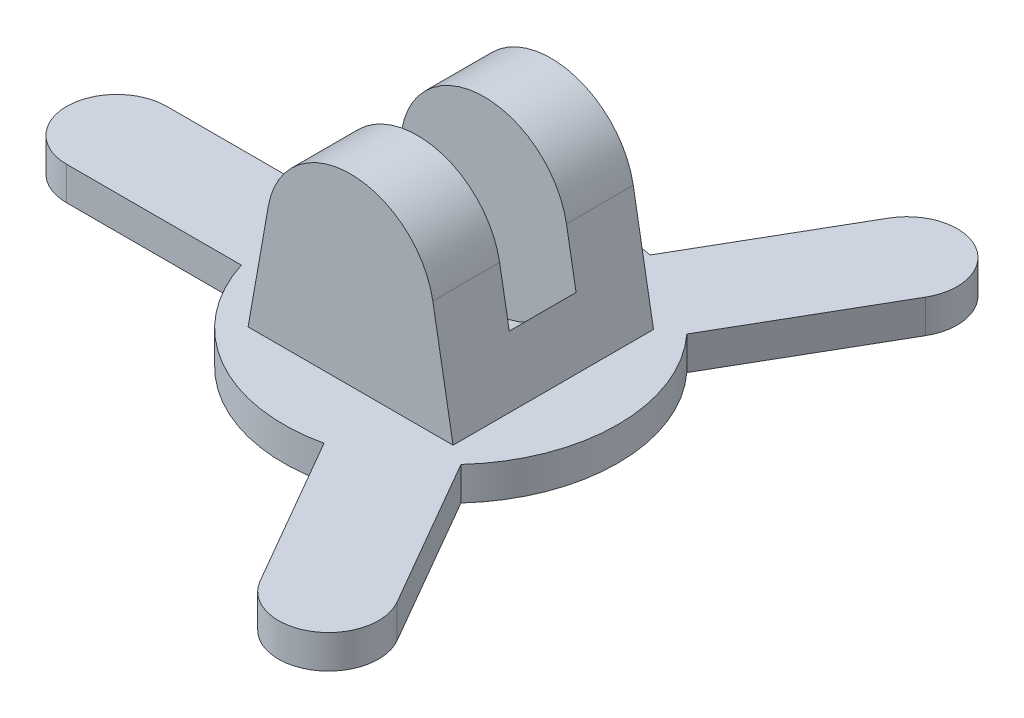
ISO-10303-21;
HEADER;
FILE_DESCRIPTION(('STEP AP214'),'2;1');
FILE_NAME('part.step','',(''),(''),'','','');
FILE_SCHEMA(('AUTOMOTIVE_DESIGN { 1 0 10303 214 1 1 1 1 }'));
ENDSEC;
DATA;
#1=APPLICATION_CONTEXT('core data for automotive mechanical design processes');
#2=APPLICATION_PROTOCOL_DEFINITION('international standard','automotive_design',2000,#1);
#3=PRODUCT_CONTEXT('',#1,'mechanical');
#4=PRODUCT('Part','Part','',(#3));
#5=PRODUCT_RELATED_PRODUCT_CATEGORY('part','',(#4));
#6=PRODUCT_DEFINITION_FORMATION('','',#4);
#7=PRODUCT_DEFINITION_CONTEXT('part definition',#1,'design');
#8=PRODUCT_DEFINITION('design','',#6,#7);
#9=PRODUCT_DEFINITION_SHAPE('','',#8);
#10=(LENGTH_UNIT() NAMED_UNIT(*) SI_UNIT(.MILLI.,.METRE.));
#11=(NAMED_UNIT(*) PLANE_ANGLE_UNIT() SI_UNIT($,.RADIAN.));
#12=(NAMED_UNIT(*) SI_UNIT($,.STERADIAN.) SOLID_ANGLE_UNIT());
#13=UNCERTAINTY_MEASURE_WITH_UNIT(LENGTH_MEASURE(1.E-05),#10,'distance_accuracy_value','');
#14=(GEOMETRIC_REPRESENTATION_CONTEXT(3) GLOBAL_UNCERTAINTY_ASSIGNED_CONTEXT((#13)) GLOBAL_UNIT_ASSIGNED_CONTEXT((#10,
#11,#12)) REPRESENTATION_CONTEXT('',''));
#15=CARTESIAN_POINT('',(0.,0.,0.));
#16=DIRECTION('',(0.,0.,1.));
#17=DIRECTION('',(1.,0.,0.));
#18=AXIS2_PLACEMENT_3D('',#15,#16,#17);
#19=CARTESIAN_POINT('',(12.3100969126526,2.17060222083668,15.));
#20=DIRECTION('',(-0.984807753012207,-0.173648177666934,0.));
#21=DIRECTION('',(0.173648177666934,-0.984807753012207,0.));
#22=AXIS2_PLACEMENT_3D('',#19,#20,#21);
#23=PLANE('',#22);
#24=DIRECTION('',(-0.173648177666934,0.984807753012207,0.));
#25=VECTOR('',#24,1.);
#26=CARTESIAN_POINT('',(12.3100969126526,2.17060222083668,-5.));
#27=LINE('',#26,#25);
#28=CARTESIAN_POINT('',(13.7499115397781,-5.99499229759953,-5.));
#29=VERTEX_POINT('',#28);
#30=CARTESIAN_POINT('',(12.3100969126526,2.17060222083668,-5.));
#31=VERTEX_POINT('',#30);
#32=EDGE_CURVE('E211',#29,#31,#27,.T.);
#33=ORIENTED_EDGE('',*,*,#32,.F.);
#34=DIRECTION('',(0.,0.,-1.));
#35=VECTOR('',#34,1.);
#36=CARTESIAN_POINT('',(13.7499115397781,-5.99499229759953,47.4264068711929));
#37=LINE('',#36,#35);
#38=CARTESIAN_POINT('',(13.7499115397781,-5.99499229759953,5.));
#39=VERTEX_POINT('',#38);
#40=EDGE_CURVE('E213',#39,#29,#37,.T.);
#41=ORIENTED_EDGE('',*,*,#40,.F.);
#42=DIRECTION('',(-0.173648177666934,0.984807753012207,0.));
#43=VECTOR('',#42,1.);
#44=CARTESIAN_POINT('',(12.3100969126526,2.17060222083668,5.));
#45=LINE('',#44,#43);
#46=CARTESIAN_POINT('',(12.3100969126526,2.17060222083668,5.));
#47=VERTEX_POINT('',#46);
#48=EDGE_CURVE('E199',#39,#47,#45,.T.);
#49=ORIENTED_EDGE('',*,*,#48,.T.);
#50=DIRECTION('',(0.,0.,-1.));
#51=VECTOR('',#50,1.);
#52=CARTESIAN_POINT('',(12.3100969126526,2.17060222083668,15.));
#53=LINE('',#52,#51);
#54=CARTESIAN_POINT('',(12.3100969126526,2.17060222083668,15.));
#55=VERTEX_POINT('',#54);
#56=EDGE_CURVE('E48',#55,#47,#53,.T.);
#57=ORIENTED_EDGE('',*,*,#56,.F.);
#58=DIRECTION('',(-0.173648177666934,0.984807753012207,0.));
#59=VECTOR('',#58,1.);
#60=CARTESIAN_POINT('',(12.3100969126526,2.17060222083668,15.));
#61=LINE('',#60,#59);
#62=CARTESIAN_POINT('',(15.3377373591989,-15.,15.));
#63=VERTEX_POINT('',#62);
#64=EDGE_CURVE('E310',#63,#55,#61,.T.);
#65=ORIENTED_EDGE('',*,*,#64,.F.);
#66=DIRECTION('',(0.,0.,-1.));
#67=VECTOR('',#66,1.);
#68=CARTESIAN_POINT('',(15.3377373591989,-15.,15.));
#69=LINE('',#68,#67);
#70=CARTESIAN_POINT('',(15.3377373591989,-15.,-15.));
#71=VERTEX_POINT('',#70);
#72=EDGE_CURVE('E78',#63,#71,#69,.T.);
#73=ORIENTED_EDGE('',*,*,#72,.T.);
#74=DIRECTION('',(-0.173648177666934,0.984807753012207,0.));
#75=VECTOR('',#74,1.);
#76=CARTESIAN_POINT('',(12.3100969126526,2.17060222083668,-15.));
#77=LINE('',#76,#75);
#78=CARTESIAN_POINT('',(12.3100969126526,2.17060222083668,-15.));
#79=VERTEX_POINT('',#78);
#80=EDGE_CURVE('E308',#71,#79,#77,.T.);
#81=ORIENTED_EDGE('',*,*,#80,.T.);
#82=EDGE_CURVE('E328',#31,#79,#53,.T.);
#83=ORIENTED_EDGE('',*,*,#82,.F.);
#84=EDGE_LOOP('',(#33,#41,#49,#57,#65,#73,#81,#83));
#85=FACE_BOUND('',#84,.T.);
#86=ADVANCED_FACE('F40',(#85),#23,.F.);
#87=CARTESIAN_POINT('',(-12.3100969126526,2.17060222083668,15.));
#88=DIRECTION('',(0.984807753012207,-0.173648177666934,0.));
#89=DIRECTION('',(0.173648177666934,0.984807753012207,0.));
#90=AXIS2_PLACEMENT_3D('',#87,#88,#89);
#91=PLANE('',#90);
#92=DIRECTION('',(-0.173648177666934,-0.984807753012207,0.));
#93=VECTOR('',#92,1.);
#94=CARTESIAN_POINT('',(-12.3100969126526,2.17060222083668,-5.));
#95=LINE('',#94,#93);
#96=CARTESIAN_POINT('',(-12.3100969126526,2.17060222083668,-5.));
#97=VERTEX_POINT('',#96);
#98=CARTESIAN_POINT('',(-13.7499115397781,-5.99499229759954,-5.));
#99=VERTEX_POINT('',#98);
#100=EDGE_CURVE('E206',#97,#99,#95,.T.);
#101=ORIENTED_EDGE('',*,*,#100,.F.);
#102=DIRECTION('',(0.,0.,-1.));
#103=VECTOR('',#102,1.);
#104=CARTESIAN_POINT('',(-12.3100969126526,2.17060222083668,15.));
#105=LINE('',#104,#103);
#106=CARTESIAN_POINT('',(-12.3100969126526,2.17060222083668,-15.));
#107=VERTEX_POINT('',#106);
#108=EDGE_CURVE('E71',#97,#107,#105,.T.);
#109=ORIENTED_EDGE('',*,*,#108,.T.);
#110=DIRECTION('',(-0.173648177666934,-0.984807753012207,0.));
#111=VECTOR('',#110,1.);
#112=CARTESIAN_POINT('',(-12.3100969126526,2.17060222083668,-15.));
#113=LINE('',#112,#111);
#114=CARTESIAN_POINT('',(-15.3377373591989,-15.,-15.));
#115=VERTEX_POINT('',#114);
#116=EDGE_CURVE('E320',#107,#115,#113,.T.);
#117=ORIENTED_EDGE('',*,*,#116,.T.);
#118=DIRECTION('',(0.,0.,-1.));
#119=VECTOR('',#118,1.);
#120=CARTESIAN_POINT('',(-15.3377373591989,-15.,15.));
#121=LINE('',#120,#119);
#122=CARTESIAN_POINT('',(-15.3377373591989,-15.,15.));
#123=VERTEX_POINT('',#122);
#124=EDGE_CURVE('E325',#123,#115,#121,.T.);
#125=ORIENTED_EDGE('',*,*,#124,.F.);
#126=DIRECTION('',(-0.173648177666934,-0.984807753012207,0.));
#127=VECTOR('',#126,1.);
#128=CARTESIAN_POINT('',(-12.3100969126526,2.17060222083668,15.));
#129=LINE('',#128,#127);
#130=CARTESIAN_POINT('',(-12.3100969126526,2.17060222083668,15.));
#131=VERTEX_POINT('',#130);
#132=EDGE_CURVE('E314',#131,#123,#129,.T.);
#133=ORIENTED_EDGE('',*,*,#132,.F.);
#134=CARTESIAN_POINT('',(-12.3100969126526,2.17060222083668,5.));
#135=VERTEX_POINT('',#134);
#136=EDGE_CURVE('E204',#131,#135,#105,.T.);
#137=ORIENTED_EDGE('',*,*,#136,.T.);
#138=DIRECTION('',(-0.173648177666934,-0.984807753012207,0.));
#139=VECTOR('',#138,1.);
#140=CARTESIAN_POINT('',(-12.3100969126526,2.17060222083668,5.));
#141=LINE('',#140,#139);
#142=CARTESIAN_POINT('',(-13.7499115397781,-5.99499229759954,5.));
#143=VERTEX_POINT('',#142);
#144=EDGE_CURVE('E197',#135,#143,#141,.T.);
#145=ORIENTED_EDGE('',*,*,#144,.T.);
#146=DIRECTION('',(0.,0.,-1.));
#147=VECTOR('',#146,1.);
#148=CARTESIAN_POINT('',(-13.7499115397781,-5.99499229759954,47.4264068711929));
#149=LINE('',#148,#147);
#150=EDGE_CURVE('E11',#99,#143,#149,.F.);
#151=ORIENTED_EDGE('',*,*,#150,.F.);
#152=EDGE_LOOP('',(#101,#109,#117,#125,#133,#137,#145,#151));
#153=FACE_BOUND('',#152,.T.);
#154=ADVANCED_FACE('F202',(#153),#91,.F.);
#155=CARTESIAN_POINT('',(0.,0.,15.));
#156=DIRECTION('',(0.,0.,-1.));
#157=DIRECTION('',(-1.,0.,0.));
#158=AXIS2_PLACEMENT_3D('',#155,#156,#157);
#159=CYLINDRICAL_SURFACE('',#158,12.5);
#160=CARTESIAN_POINT('',(0.,0.,-5.));
#161=DIRECTION('',(0.,0.,1.));
#162=DIRECTION('',(1.,0.,0.));
#163=AXIS2_PLACEMENT_3D('',#160,#161,#162);
#164=CIRCLE('',#163,12.5);
#165=EDGE_CURVE('E305',#31,#97,#164,.T.);
#166=ORIENTED_EDGE('',*,*,#165,.F.);
#167=ORIENTED_EDGE('',*,*,#82,.T.);
#168=CARTESIAN_POINT('',(0.,0.,-15.));
#169=DIRECTION('',(0.,0.,1.));
#170=DIRECTION('',(1.,0.,0.));
#171=AXIS2_PLACEMENT_3D('',#168,#169,#170);
#172=CIRCLE('',#171,12.5);
#173=EDGE_CURVE('E318',#79,#107,#172,.T.);
#174=ORIENTED_EDGE('',*,*,#173,.T.);
#175=ORIENTED_EDGE('',*,*,#108,.F.);
#176=EDGE_LOOP('',(#166,#167,#174,#175));
#177=FACE_BOUND('',#176,.T.);
#178=ADVANCED_FACE('F334',(#177),#159,.T.);
#179=ORIENTED_EDGE('',*,*,#56,.T.);
#180=CARTESIAN_POINT('',(0.,0.,5.));
#181=DIRECTION('',(0.,0.,1.));
#182=DIRECTION('',(1.,0.,0.));
#183=AXIS2_PLACEMENT_3D('',#180,#181,#182);
#184=CIRCLE('',#183,12.5);
#185=EDGE_CURVE('E304',#47,#135,#184,.T.);
#186=ORIENTED_EDGE('',*,*,#185,.T.);
#187=ORIENTED_EDGE('',*,*,#136,.F.);
#188=CARTESIAN_POINT('',(0.,0.,15.));
#189=DIRECTION('',(0.,0.,1.));
#190=DIRECTION('',(1.,0.,0.));
#191=AXIS2_PLACEMENT_3D('',#188,#189,#190);
#192=CIRCLE('',#191,12.5);
#193=EDGE_CURVE('E86',#55,#131,#192,.T.);
#194=ORIENTED_EDGE('',*,*,#193,.F.);
#195=EDGE_LOOP('',(#179,#186,#187,#194));
#196=FACE_BOUND('',#195,.T.);
#197=ADVANCED_FACE('F348',(#196),#159,.T.);
#198=CARTESIAN_POINT('',(0.,0.,15.));
#199=DIRECTION('',(0.,0.,1.));
#200=DIRECTION('',(1.,0.,0.));
#201=AXIS2_PLACEMENT_3D('',#198,#199,#200);
#202=PLANE('',#201);
#203=ORIENTED_EDGE('',*,*,#64,.T.);
#204=ORIENTED_EDGE('',*,*,#193,.T.);
#205=ORIENTED_EDGE('',*,*,#132,.T.);
#206=DIRECTION('',(1.,0.,0.));
#207=VECTOR('',#206,1.);
#208=CARTESIAN_POINT('',(0.,-15.,15.));
#209=LINE('',#208,#207);
#210=EDGE_CURVE('E56',#123,#63,#209,.T.);
#211=ORIENTED_EDGE('',*,*,#210,.T.);
#212=EDGE_LOOP('',(#203,#204,#205,#211));
#213=FACE_BOUND('',#212,.T.);
#214=ADVANCED_FACE('F352',(#213),#202,.T.);
#215=CARTESIAN_POINT('',(0.,0.,-15.));
#216=DIRECTION('',(0.,0.,1.));
#217=DIRECTION('',(1.,0.,0.));
#218=AXIS2_PLACEMENT_3D('',#215,#216,#217);
#219=PLANE('',#218);
#220=ORIENTED_EDGE('',*,*,#80,.F.);
#221=DIRECTION('',(1.,0.,0.));
#222=VECTOR('',#221,1.);
#223=CARTESIAN_POINT('',(0.,-15.,-15.));
#224=LINE('',#223,#222);
#225=EDGE_CURVE('E312',#115,#71,#224,.T.);
#226=ORIENTED_EDGE('',*,*,#225,.F.);
#227=ORIENTED_EDGE('',*,*,#116,.F.);
#228=ORIENTED_EDGE('',*,*,#173,.F.);
#229=EDGE_LOOP('',(#220,#226,#227,#228));
#230=FACE_BOUND('',#229,.T.);
#231=ADVANCED_FACE('F338',(#230),#219,.F.);
#232=CARTESIAN_POINT('',(0.,0.,-5.));
#233=DIRECTION('',(0.,0.,1.));
#234=DIRECTION('',(1.,0.,0.));
#235=AXIS2_PLACEMENT_3D('',#232,#233,#234);
#236=PLANE('',#235);
#237=ORIENTED_EDGE('',*,*,#165,.T.);
#238=ORIENTED_EDGE('',*,*,#100,.T.);
#239=CARTESIAN_POINT('',(0.,0.,-5.));
#240=DIRECTION('',(0.,0.,1.));
#241=DIRECTION('',(1.,0.,0.));
#242=AXIS2_PLACEMENT_3D('',#239,#240,#241);
#243=CIRCLE('',#242,15.);
#244=EDGE_CURVE('E192',#99,#29,#243,.T.);
#245=ORIENTED_EDGE('',*,*,#244,.T.);
#246=ORIENTED_EDGE('',*,*,#32,.T.);
#247=EDGE_LOOP('',(#237,#238,#245,#246));
#248=FACE_BOUND('',#247,.T.);
#249=ADVANCED_FACE('F360',(#248),#236,.T.);
#250=CARTESIAN_POINT('',(0.,0.,5.));
#251=DIRECTION('',(0.,0.,1.));
#252=DIRECTION('',(1.,0.,0.));
#253=AXIS2_PLACEMENT_3D('',#250,#251,#252);
#254=PLANE('',#253);
#255=ORIENTED_EDGE('',*,*,#185,.F.);
#256=ORIENTED_EDGE('',*,*,#48,.F.);
#257=CARTESIAN_POINT('',(0.,0.,5.));
#258=DIRECTION('',(0.,0.,1.));
#259=DIRECTION('',(1.,0.,0.));
#260=AXIS2_PLACEMENT_3D('',#257,#258,#259);
#261=CIRCLE('',#260,15.);
#262=EDGE_CURVE('E189',#143,#39,#261,.T.);
#263=ORIENTED_EDGE('',*,*,#262,.F.);
#264=ORIENTED_EDGE('',*,*,#144,.F.);
#265=EDGE_LOOP('',(#255,#256,#263,#264));
#266=FACE_BOUND('',#265,.T.);
#267=ADVANCED_FACE('F196',(#266),#254,.F.);
#268=CARTESIAN_POINT('',(0.,-15.,0.));
#269=DIRECTION('',(0.,-1.,0.));
#270=DIRECTION('',(0.,0.,-1.));
#271=AXIS2_PLACEMENT_3D('',#268,#269,#270);
#272=PLANE('',#271);
#273=CARTESIAN_POINT('',(0.,-15.,0.));
#274=DIRECTION('',(0.,-1.,0.));
#275=DIRECTION('',(0.,0.,-1.));
#276=AXIS2_PLACEMENT_3D('',#273,#274,#275);
#277=CIRCLE('',#276,25.);
#278=CARTESIAN_POINT('',(18.419430546095,-15.,-16.9033895523231));
#279=VERTEX_POINT('',#278);
#280=CARTESIAN_POINT('',(18.4194305460952,-15.,16.9033895523228));
#281=VERTEX_POINT('',#280);
#282=EDGE_CURVE('E215',#279,#281,#277,.T.);
#283=ORIENTED_EDGE('',*,*,#282,.F.);
#284=DIRECTION('',(0.499999999999992,0.,-0.866025403784443));
#285=VECTOR('',#284,1.);
#286=CARTESIAN_POINT('',(6.49519052838332,-15.,3.74999999999994));
#287=LINE('',#286,#285);
#288=CARTESIAN_POINT('',(31.4951905283829,-15.,-39.5512701892222));
#289=VERTEX_POINT('',#288);
#290=EDGE_CURVE('E220',#279,#289,#287,.T.);
#291=ORIENTED_EDGE('',*,*,#290,.T.);
#292=CARTESIAN_POINT('',(24.9999999999996,-15.,-43.3012701892222));
#293=DIRECTION('',(0.,-1.,0.));
#294=DIRECTION('',(0.,0.,-1.));
#295=AXIS2_PLACEMENT_3D('',#292,#293,#294);
#296=CIRCLE('',#295,7.5);
#297=CARTESIAN_POINT('',(18.5048094716163,-15.,-47.0512701892221));
#298=VERTEX_POINT('',#297);
#299=EDGE_CURVE('E270',#298,#289,#296,.T.);
#300=ORIENTED_EDGE('',*,*,#299,.F.);
#301=DIRECTION('',(0.499999999999992,0.,-0.866025403784443));
#302=VECTOR('',#301,1.);
#303=CARTESIAN_POINT('',(-6.49519052838333,-15.,-3.74999999999994));
#304=LINE('',#303,#302);
#305=CARTESIAN_POINT('',(5.42904948932831,-15.,-24.4033895523229));
#306=VERTEX_POINT('',#305);
#307=EDGE_CURVE('E268',#306,#298,#304,.T.);
#308=ORIENTED_EDGE('',*,*,#307,.F.);
#309=CARTESIAN_POINT('',(0.,-15.,0.));
#310=DIRECTION('',(0.,-1.,0.));
#311=DIRECTION('',(0.,0.,-1.));
#312=AXIS2_PLACEMENT_3D('',#309,#310,#311);
#313=CIRCLE('',#312,25.);
#314=CARTESIAN_POINT('',(-23.8484800354236,-15.,-7.5));
#315=VERTEX_POINT('',#314);
#316=EDGE_CURVE('E266',#315,#306,#313,.T.);
#317=ORIENTED_EDGE('',*,*,#316,.F.);
#318=DIRECTION('',(-1.,0.,0.));
#319=VECTOR('',#318,1.);
#320=CARTESIAN_POINT('',(0.,-15.,-7.5));
#321=LINE('',#320,#319);
#322=CARTESIAN_POINT('',(-50.,-15.,-7.50000000000001));
#323=VERTEX_POINT('',#322);
#324=EDGE_CURVE('E263',#315,#323,#321,.T.);
#325=ORIENTED_EDGE('',*,*,#324,.T.);
#326=CARTESIAN_POINT('',(-50.,-15.,0.));
#327=DIRECTION('',(0.,-1.,0.));
#328=DIRECTION('',(0.,0.,-1.));
#329=AXIS2_PLACEMENT_3D('',#326,#327,#328);
#330=CIRCLE('',#329,7.5);
#331=CARTESIAN_POINT('',(-50.,-15.,7.49999999999999));
#332=VERTEX_POINT('',#331);
#333=EDGE_CURVE('E260',#332,#323,#330,.T.);
#334=ORIENTED_EDGE('',*,*,#333,.F.);
#335=DIRECTION('',(-1.,0.,0.));
#336=VECTOR('',#335,1.);
#337=CARTESIAN_POINT('',(0.,-15.,7.5));
#338=LINE('',#337,#336);
#339=CARTESIAN_POINT('',(-23.8484800354236,-15.,7.5));
#340=VERTEX_POINT('',#339);
#341=EDGE_CURVE('E258',#340,#332,#338,.T.);
#342=ORIENTED_EDGE('',*,*,#341,.F.);
#343=CARTESIAN_POINT('',(0.,-15.,0.));
#344=DIRECTION('',(0.,-1.,0.));
#345=DIRECTION('',(0.,0.,-1.));
#346=AXIS2_PLACEMENT_3D('',#343,#344,#345);
#347=CIRCLE('',#346,25.);
#348=CARTESIAN_POINT('',(5.42904948932864,-15.,24.4033895523229));
#349=VERTEX_POINT('',#348);
#350=EDGE_CURVE('E256',#349,#340,#347,.T.);
#351=ORIENTED_EDGE('',*,*,#350,.F.);
#352=DIRECTION('',(0.500000000000004,0.,0.866025403784436));
#353=VECTOR('',#352,1.);
#354=CARTESIAN_POINT('',(-6.49519052838328,-15.,3.75000000000003));
#355=LINE('',#354,#353);
#356=CARTESIAN_POINT('',(18.5048094716169,-15.,47.0512701892219));
#357=VERTEX_POINT('',#356);
#358=EDGE_CURVE('E253',#349,#357,#355,.T.);
#359=ORIENTED_EDGE('',*,*,#358,.T.);
#360=CARTESIAN_POINT('',(25.0000000000002,-15.,43.3012701892218));
#361=DIRECTION('',(0.,-1.,0.));
#362=DIRECTION('',(0.,0.,-1.));
#363=AXIS2_PLACEMENT_3D('',#360,#361,#362);
#364=CIRCLE('',#363,7.5);
#365=CARTESIAN_POINT('',(31.4951905283835,-15.,39.5512701892218));
#366=VERTEX_POINT('',#365);
#367=EDGE_CURVE('E250',#366,#357,#364,.T.);
#368=ORIENTED_EDGE('',*,*,#367,.F.);
#369=DIRECTION('',(0.500000000000004,0.,0.866025403784436));
#370=VECTOR('',#369,1.);
#371=CARTESIAN_POINT('',(6.49519052838328,-15.,-3.75000000000003));
#372=LINE('',#371,#370);
#373=EDGE_CURVE('E248',#281,#366,#372,.T.);
#374=ORIENTED_EDGE('',*,*,#373,.F.);
#375=EDGE_LOOP('',(#283,#291,#300,#308,#317,#325,#334,#342,#351,#359,#368,#374));
#376=FACE_BOUND('',#375,.T.);
#377=ORIENTED_EDGE('',*,*,#124,.T.);
#378=ORIENTED_EDGE('',*,*,#225,.T.);
#379=ORIENTED_EDGE('',*,*,#72,.F.);
#380=ORIENTED_EDGE('',*,*,#210,.F.);
#381=EDGE_LOOP('',(#377,#378,#379,#380));
#382=FACE_BOUND('',#381,.T.);
#383=ADVANCED_FACE('F364',(#376,#382),#272,.F.);
#384=CARTESIAN_POINT('',(0.,-20.,0.));
#385=DIRECTION('',(0.,1.,0.));
#386=DIRECTION('',(0.,0.,1.));
#387=AXIS2_PLACEMENT_3D('',#384,#385,#386);
#388=CYLINDRICAL_SURFACE('',#387,25.);
#389=ORIENTED_EDGE('',*,*,#282,.T.);
#390=DIRECTION('',(0.,1.,0.));
#391=VECTOR('',#390,1.);
#392=CARTESIAN_POINT('',(18.4194305460952,-20.,16.9033895523228));
#393=LINE('',#392,#391);
#394=CARTESIAN_POINT('',(18.4194305460952,-20.,16.9033895523228));
#395=VERTEX_POINT('',#394);
#396=EDGE_CURVE('E301',#395,#281,#393,.T.);
#397=ORIENTED_EDGE('',*,*,#396,.F.);
#398=CARTESIAN_POINT('',(0.,-20.,0.));
#399=DIRECTION('',(0.,-1.,0.));
#400=DIRECTION('',(0.,0.,-1.));
#401=AXIS2_PLACEMENT_3D('',#398,#399,#400);
#402=CIRCLE('',#401,25.);
#403=CARTESIAN_POINT('',(18.419430546095,-20.,-16.9033895523231));
#404=VERTEX_POINT('',#403);
#405=EDGE_CURVE('E216',#404,#395,#402,.T.);
#406=ORIENTED_EDGE('',*,*,#405,.F.);
#407=DIRECTION('',(0.,1.,0.));
#408=VECTOR('',#407,1.);
#409=CARTESIAN_POINT('',(18.419430546095,-20.,-16.9033895523231));
#410=LINE('',#409,#408);
#411=EDGE_CURVE('E245',#404,#279,#410,.T.);
#412=ORIENTED_EDGE('',*,*,#411,.T.);
#413=EDGE_LOOP('',(#389,#397,#406,#412));
#414=FACE_BOUND('',#413,.T.);
#415=ADVANCED_FACE('F367',(#414),#388,.T.);
#416=CARTESIAN_POINT('',(6.49519052838328,-20.,-3.75000000000003));
#417=DIRECTION('',(-0.866025403784436,0.,0.500000000000004));
#418=DIRECTION('',(0.500000000000004,0.,0.866025403784436));
#419=AXIS2_PLACEMENT_3D('',#416,#417,#418);
#420=PLANE('',#419);
#421=ORIENTED_EDGE('',*,*,#373,.T.);
#422=DIRECTION('',(0.,1.,0.));
#423=VECTOR('',#422,1.);
#424=CARTESIAN_POINT('',(31.4951905283835,-20.,39.5512701892218));
#425=LINE('',#424,#423);
#426=CARTESIAN_POINT('',(31.4951905283835,-20.,39.5512701892218));
#427=VERTEX_POINT('',#426);
#428=EDGE_CURVE('E298',#427,#366,#425,.T.);
#429=ORIENTED_EDGE('',*,*,#428,.F.);
#430=DIRECTION('',(0.500000000000004,0.,0.866025403784436));
#431=VECTOR('',#430,1.);
#432=CARTESIAN_POINT('',(6.49519052838328,-20.,-3.75000000000003));
#433=LINE('',#432,#431);
#434=EDGE_CURVE('E219',#395,#427,#433,.T.);
#435=ORIENTED_EDGE('',*,*,#434,.F.);
#436=ORIENTED_EDGE('',*,*,#396,.T.);
#437=EDGE_LOOP('',(#421,#429,#435,#436));
#438=FACE_BOUND('',#437,.T.);
#439=ADVANCED_FACE('F370',(#438),#420,.F.);
#440=CARTESIAN_POINT('',(25.0000000000002,-20.,43.3012701892218));
#441=DIRECTION('',(0.,1.,0.));
#442=DIRECTION('',(0.,0.,1.));
#443=AXIS2_PLACEMENT_3D('',#440,#441,#442);
#444=CYLINDRICAL_SURFACE('',#443,7.5);
#445=ORIENTED_EDGE('',*,*,#367,.T.);
#446=DIRECTION('',(0.,1.,0.));
#447=VECTOR('',#446,1.);
#448=CARTESIAN_POINT('',(18.5048094716169,-20.,47.0512701892219));
#449=LINE('',#448,#447);
#450=CARTESIAN_POINT('',(18.5048094716169,-20.,47.0512701892219));
#451=VERTEX_POINT('',#450);
#452=EDGE_CURVE('E296',#451,#357,#449,.T.);
#453=ORIENTED_EDGE('',*,*,#452,.F.);
#454=CARTESIAN_POINT('',(25.0000000000002,-20.,43.3012701892218));
#455=DIRECTION('',(0.,-1.,0.));
#456=DIRECTION('',(0.,0.,-1.));
#457=AXIS2_PLACEMENT_3D('',#454,#455,#456);
#458=CIRCLE('',#457,7.5);
#459=EDGE_CURVE('E222',#427,#451,#458,.T.);
#460=ORIENTED_EDGE('',*,*,#459,.F.);
#461=ORIENTED_EDGE('',*,*,#428,.T.);
#462=EDGE_LOOP('',(#445,#453,#460,#461));
#463=FACE_BOUND('',#462,.T.);
#464=ADVANCED_FACE('F374',(#463),#444,.T.);
#465=CARTESIAN_POINT('',(-6.49519052838328,-20.,3.75000000000003));
#466=DIRECTION('',(-0.866025403784436,0.,0.500000000000004));
#467=DIRECTION('',(0.500000000000004,0.,0.866025403784436));
#468=AXIS2_PLACEMENT_3D('',#465,#466,#467);
#469=PLANE('',#468);
#470=ORIENTED_EDGE('',*,*,#358,.F.);
#471=DIRECTION('',(0.,1.,0.));
#472=VECTOR('',#471,1.);
#473=CARTESIAN_POINT('',(5.42904948932864,-20.,24.4033895523229));
#474=LINE('',#473,#472);
#475=CARTESIAN_POINT('',(5.42904948932864,-20.,24.4033895523229));
#476=VERTEX_POINT('',#475);
#477=EDGE_CURVE('E294',#476,#349,#474,.T.);
#478=ORIENTED_EDGE('',*,*,#477,.F.);
#479=DIRECTION('',(0.500000000000004,0.,0.866025403784436));
#480=VECTOR('',#479,1.);
#481=CARTESIAN_POINT('',(-6.49519052838328,-20.,3.75000000000003));
#482=LINE('',#481,#480);
#483=EDGE_CURVE('E224',#476,#451,#482,.T.);
#484=ORIENTED_EDGE('',*,*,#483,.T.);
#485=ORIENTED_EDGE('',*,*,#452,.T.);
#486=EDGE_LOOP('',(#470,#478,#484,#485));
#487=FACE_BOUND('',#486,.T.);
#488=ADVANCED_FACE('F378',(#487),#469,.T.);
#489=CARTESIAN_POINT('',(0.,-20.,0.));
#490=DIRECTION('',(0.,1.,0.));
#491=DIRECTION('',(0.,0.,1.));
#492=AXIS2_PLACEMENT_3D('',#489,#490,#491);
#493=CYLINDRICAL_SURFACE('',#492,25.);
#494=ORIENTED_EDGE('',*,*,#350,.T.);
#495=DIRECTION('',(0.,1.,0.));
#496=VECTOR('',#495,1.);
#497=CARTESIAN_POINT('',(-23.8484800354236,-20.,7.5));
#498=LINE('',#497,#496);
#499=CARTESIAN_POINT('',(-23.8484800354236,-20.,7.5));
#500=VERTEX_POINT('',#499);
#501=EDGE_CURVE('E291',#500,#340,#498,.T.);
#502=ORIENTED_EDGE('',*,*,#501,.F.);
#503=CARTESIAN_POINT('',(0.,-20.,0.));
#504=DIRECTION('',(0.,-1.,0.));
#505=DIRECTION('',(0.,0.,-1.));
#506=AXIS2_PLACEMENT_3D('',#503,#504,#505);
#507=CIRCLE('',#506,25.);
#508=EDGE_CURVE('E227',#476,#500,#507,.T.);
#509=ORIENTED_EDGE('',*,*,#508,.F.);
#510=ORIENTED_EDGE('',*,*,#477,.T.);
#511=EDGE_LOOP('',(#494,#502,#509,#510));
#512=FACE_BOUND('',#511,.T.);
#513=ADVANCED_FACE('F382',(#512),#493,.T.);
#514=CARTESIAN_POINT('',(0.,-20.,7.5));
#515=DIRECTION('',(0.,0.,-1.));
#516=DIRECTION('',(-1.,0.,0.));
#517=AXIS2_PLACEMENT_3D('',#514,#515,#516);
#518=PLANE('',#517);
#519=ORIENTED_EDGE('',*,*,#341,.T.);
#520=DIRECTION('',(0.,1.,0.));
#521=VECTOR('',#520,1.);
#522=CARTESIAN_POINT('',(-50.,-20.,7.49999999999999));
#523=LINE('',#522,#521);
#524=CARTESIAN_POINT('',(-50.,-20.,7.49999999999999));
#525=VERTEX_POINT('',#524);
#526=EDGE_CURVE('E288',#525,#332,#523,.T.);
#527=ORIENTED_EDGE('',*,*,#526,.F.);
#528=DIRECTION('',(-1.,0.,0.));
#529=VECTOR('',#528,1.);
#530=CARTESIAN_POINT('',(0.,-20.,7.5));
#531=LINE('',#530,#529);
#532=EDGE_CURVE('E229',#500,#525,#531,.T.);
#533=ORIENTED_EDGE('',*,*,#532,.F.);
#534=ORIENTED_EDGE('',*,*,#501,.T.);
#535=EDGE_LOOP('',(#519,#527,#533,#534));
#536=FACE_BOUND('',#535,.T.);
#537=ADVANCED_FACE('F386',(#536),#518,.F.);
#538=CARTESIAN_POINT('',(-50.,-20.,0.));
#539=DIRECTION('',(0.,1.,0.));
#540=DIRECTION('',(0.,0.,1.));
#541=AXIS2_PLACEMENT_3D('',#538,#539,#540);
#542=CYLINDRICAL_SURFACE('',#541,7.5);
#543=ORIENTED_EDGE('',*,*,#333,.T.);
#544=DIRECTION('',(0.,1.,0.));
#545=VECTOR('',#544,1.);
#546=CARTESIAN_POINT('',(-50.,-20.,-7.50000000000001));
#547=LINE('',#546,#545);
#548=CARTESIAN_POINT('',(-50.,-20.,-7.50000000000001));
#549=VERTEX_POINT('',#548);
#550=EDGE_CURVE('E286',#549,#323,#547,.T.);
#551=ORIENTED_EDGE('',*,*,#550,.F.);
#552=CARTESIAN_POINT('',(-50.,-20.,0.));
#553=DIRECTION('',(0.,-1.,0.));
#554=DIRECTION('',(0.,0.,-1.));
#555=AXIS2_PLACEMENT_3D('',#552,#553,#554);
#556=CIRCLE('',#555,7.5);
#557=EDGE_CURVE('E231',#525,#549,#556,.T.);
#558=ORIENTED_EDGE('',*,*,#557,.F.);
#559=ORIENTED_EDGE('',*,*,#526,.T.);
#560=EDGE_LOOP('',(#543,#551,#558,#559));
#561=FACE_BOUND('',#560,.T.);
#562=ADVANCED_FACE('F390',(#561),#542,.T.);
#563=CARTESIAN_POINT('',(0.,-20.,-7.5));
#564=DIRECTION('',(0.,0.,-1.));
#565=DIRECTION('',(-1.,0.,0.));
#566=AXIS2_PLACEMENT_3D('',#563,#564,#565);
#567=PLANE('',#566);
#568=ORIENTED_EDGE('',*,*,#324,.F.);
#569=DIRECTION('',(0.,1.,0.));
#570=VECTOR('',#569,1.);
#571=CARTESIAN_POINT('',(-23.8484800354236,-20.,-7.5));
#572=LINE('',#571,#570);
#573=CARTESIAN_POINT('',(-23.8484800354236,-20.,-7.5));
#574=VERTEX_POINT('',#573);
#575=EDGE_CURVE('E284',#574,#315,#572,.T.);
#576=ORIENTED_EDGE('',*,*,#575,.F.);
#577=DIRECTION('',(-1.,0.,0.));
#578=VECTOR('',#577,1.);
#579=CARTESIAN_POINT('',(0.,-20.,-7.5));
#580=LINE('',#579,#578);
#581=EDGE_CURVE('E233',#574,#549,#580,.T.);
#582=ORIENTED_EDGE('',*,*,#581,.T.);
#583=ORIENTED_EDGE('',*,*,#550,.T.);
#584=EDGE_LOOP('',(#568,#576,#582,#583));
#585=FACE_BOUND('',#584,.T.);
#586=ADVANCED_FACE('F394',(#585),#567,.T.);
#587=CARTESIAN_POINT('',(0.,-20.,0.));
#588=DIRECTION('',(0.,1.,0.));
#589=DIRECTION('',(0.,0.,1.));
#590=AXIS2_PLACEMENT_3D('',#587,#588,#589);
#591=CYLINDRICAL_SURFACE('',#590,25.);
#592=ORIENTED_EDGE('',*,*,#316,.T.);
#593=DIRECTION('',(0.,1.,0.));
#594=VECTOR('',#593,1.);
#595=CARTESIAN_POINT('',(5.42904948932831,-20.,-24.4033895523229));
#596=LINE('',#595,#594);
#597=CARTESIAN_POINT('',(5.42904948932831,-20.,-24.4033895523229));
#598=VERTEX_POINT('',#597);
#599=EDGE_CURVE('E281',#598,#306,#596,.T.);
#600=ORIENTED_EDGE('',*,*,#599,.F.);
#601=CARTESIAN_POINT('',(0.,-20.,0.));
#602=DIRECTION('',(0.,-1.,0.));
#603=DIRECTION('',(0.,0.,-1.));
#604=AXIS2_PLACEMENT_3D('',#601,#602,#603);
#605=CIRCLE('',#604,25.);
#606=EDGE_CURVE('E236',#574,#598,#605,.T.);
#607=ORIENTED_EDGE('',*,*,#606,.F.);
#608=ORIENTED_EDGE('',*,*,#575,.T.);
#609=EDGE_LOOP('',(#592,#600,#607,#608));
#610=FACE_BOUND('',#609,.T.);
#611=ADVANCED_FACE('F398',(#610),#591,.T.);
#612=CARTESIAN_POINT('',(-6.49519052838333,-20.,-3.74999999999994));
#613=DIRECTION('',(0.866025403784443,0.,0.499999999999992));
#614=DIRECTION('',(0.499999999999992,0.,-0.866025403784443));
#615=AXIS2_PLACEMENT_3D('',#612,#613,#614);
#616=PLANE('',#615);
#617=ORIENTED_EDGE('',*,*,#307,.T.);
#618=DIRECTION('',(0.,1.,0.));
#619=VECTOR('',#618,1.);
#620=CARTESIAN_POINT('',(18.5048094716163,-20.,-47.0512701892221));
#621=LINE('',#620,#619);
#622=CARTESIAN_POINT('',(18.5048094716163,-20.,-47.0512701892221));
#623=VERTEX_POINT('',#622);
#624=EDGE_CURVE('E278',#623,#298,#621,.T.);
#625=ORIENTED_EDGE('',*,*,#624,.F.);
#626=DIRECTION('',(0.499999999999992,0.,-0.866025403784443));
#627=VECTOR('',#626,1.);
#628=CARTESIAN_POINT('',(-6.49519052838333,-20.,-3.74999999999994));
#629=LINE('',#628,#627);
#630=EDGE_CURVE('E238',#598,#623,#629,.T.);
#631=ORIENTED_EDGE('',*,*,#630,.F.);
#632=ORIENTED_EDGE('',*,*,#599,.T.);
#633=EDGE_LOOP('',(#617,#625,#631,#632));
#634=FACE_BOUND('',#633,.T.);
#635=ADVANCED_FACE('F402',(#634),#616,.F.);
#636=CARTESIAN_POINT('',(24.9999999999996,-20.,-43.3012701892222));
#637=DIRECTION('',(0.,1.,0.));
#638=DIRECTION('',(0.,0.,1.));
#639=AXIS2_PLACEMENT_3D('',#636,#637,#638);
#640=CYLINDRICAL_SURFACE('',#639,7.5);
#641=ORIENTED_EDGE('',*,*,#299,.T.);
#642=DIRECTION('',(0.,1.,0.));
#643=VECTOR('',#642,1.);
#644=CARTESIAN_POINT('',(31.4951905283829,-20.,-39.5512701892222));
#645=LINE('',#644,#643);
#646=CARTESIAN_POINT('',(31.4951905283829,-20.,-39.5512701892222));
#647=VERTEX_POINT('',#646);
#648=EDGE_CURVE('E276',#647,#289,#645,.T.);
#649=ORIENTED_EDGE('',*,*,#648,.F.);
#650=CARTESIAN_POINT('',(24.9999999999996,-20.,-43.3012701892222));
#651=DIRECTION('',(0.,-1.,0.));
#652=DIRECTION('',(0.,0.,-1.));
#653=AXIS2_PLACEMENT_3D('',#650,#651,#652);
#654=CIRCLE('',#653,7.5);
#655=EDGE_CURVE('E240',#623,#647,#654,.T.);
#656=ORIENTED_EDGE('',*,*,#655,.F.);
#657=ORIENTED_EDGE('',*,*,#624,.T.);
#658=EDGE_LOOP('',(#641,#649,#656,#657));
#659=FACE_BOUND('',#658,.T.);
#660=ADVANCED_FACE('F406',(#659),#640,.T.);
#661=CARTESIAN_POINT('',(6.49519052838332,-20.,3.74999999999994));
#662=DIRECTION('',(0.866025403784443,0.,0.499999999999992));
#663=DIRECTION('',(0.499999999999992,0.,-0.866025403784443));
#664=AXIS2_PLACEMENT_3D('',#661,#662,#663);
#665=PLANE('',#664);
#666=ORIENTED_EDGE('',*,*,#290,.F.);
#667=ORIENTED_EDGE('',*,*,#411,.F.);
#668=DIRECTION('',(0.499999999999992,0.,-0.866025403784443));
#669=VECTOR('',#668,1.);
#670=CARTESIAN_POINT('',(6.49519052838332,-20.,3.74999999999994));
#671=LINE('',#670,#669);
#672=EDGE_CURVE('E242',#404,#647,#671,.T.);
#673=ORIENTED_EDGE('',*,*,#672,.T.);
#674=ORIENTED_EDGE('',*,*,#648,.T.);
#675=EDGE_LOOP('',(#666,#667,#673,#674));
#676=FACE_BOUND('',#675,.T.);
#677=ADVANCED_FACE('F410',(#676),#665,.T.);
#678=CARTESIAN_POINT('',(0.,-20.,0.));
#679=DIRECTION('',(0.,-1.,0.));
#680=DIRECTION('',(0.,0.,-1.));
#681=AXIS2_PLACEMENT_3D('',#678,#679,#680);
#682=PLANE('',#681);
#683=ORIENTED_EDGE('',*,*,#405,.T.);
#684=ORIENTED_EDGE('',*,*,#434,.T.);
#685=ORIENTED_EDGE('',*,*,#459,.T.);
#686=ORIENTED_EDGE('',*,*,#483,.F.);
#687=ORIENTED_EDGE('',*,*,#508,.T.);
#688=ORIENTED_EDGE('',*,*,#532,.T.);
#689=ORIENTED_EDGE('',*,*,#557,.T.);
#690=ORIENTED_EDGE('',*,*,#581,.F.);
#691=ORIENTED_EDGE('',*,*,#606,.T.);
#692=ORIENTED_EDGE('',*,*,#630,.T.);
#693=ORIENTED_EDGE('',*,*,#655,.T.);
#694=ORIENTED_EDGE('',*,*,#672,.F.);
#695=EDGE_LOOP('',(#683,#684,#685,#686,#687,#688,#689,#690,#691,#692,#693,#694));
#696=FACE_BOUND('',#695,.T.);
#697=ADVANCED_FACE('F414',(#696),#682,.T.);
#698=CARTESIAN_POINT('',(0.,0.,47.4264068711929));
#699=DIRECTION('',(0.,0.,-1.));
#700=DIRECTION('',(-1.,0.,0.));
#701=AXIS2_PLACEMENT_3D('',#698,#699,#700);
#702=CYLINDRICAL_SURFACE('',#701,15.);
#703=ORIENTED_EDGE('',*,*,#40,.T.);
#704=ORIENTED_EDGE('',*,*,#244,.F.);
#705=ORIENTED_EDGE('',*,*,#150,.T.);
#706=ORIENTED_EDGE('',*,*,#262,.T.);
#707=EDGE_LOOP('',(#703,#704,#705,#706));
#708=FACE_BOUND('',#707,.T.);
#709=ADVANCED_FACE('F188',(#708),#702,.F.);
#710=CLOSED_SHELL('',(#86,#154,#178,#197,#214,#231,#249,#267,#383,#415,#439,#464,#488,#513,#537,
#562,#586,#611,#635,#660,#677,#697,#709));
#711=MANIFOLD_SOLID_BREP('B2',#710);
#712=ADVANCED_BREP_SHAPE_REPRESENTATION('',(#18,#711),#14);
#713=SHAPE_DEFINITION_REPRESENTATION(#9,#712);
ENDSEC;
END-ISO-10303-21;
